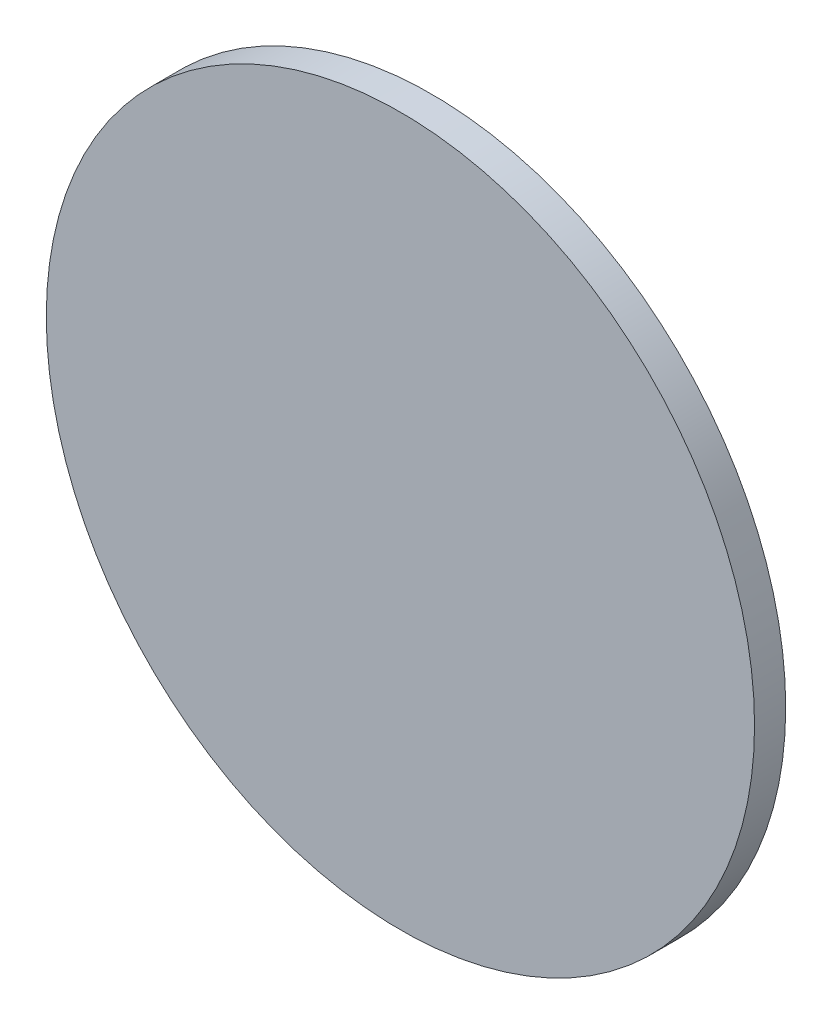
ISO-10303-21;
HEADER;
FILE_DESCRIPTION(('STEP AP214'),'2;1');
FILE_NAME('part.step','',(''),(''),'','','');
FILE_SCHEMA(('AUTOMOTIVE_DESIGN { 1 0 10303 214 1 1 1 1 }'));
ENDSEC;
DATA;
#1=APPLICATION_CONTEXT('core data for automotive mechanical design processes');
#2=APPLICATION_PROTOCOL_DEFINITION('international standard','automotive_design',2000,#1);
#3=PRODUCT_CONTEXT('',#1,'mechanical');
#4=PRODUCT('Part','Part','',(#3));
#5=PRODUCT_RELATED_PRODUCT_CATEGORY('part','',(#4));
#6=PRODUCT_DEFINITION_FORMATION('','',#4);
#7=PRODUCT_DEFINITION_CONTEXT('part definition',#1,'design');
#8=PRODUCT_DEFINITION('design','',#6,#7);
#9=PRODUCT_DEFINITION_SHAPE('','',#8);
#10=(LENGTH_UNIT() NAMED_UNIT(*) SI_UNIT(.MILLI.,.METRE.));
#11=(NAMED_UNIT(*) PLANE_ANGLE_UNIT() SI_UNIT($,.RADIAN.));
#12=(NAMED_UNIT(*) SI_UNIT($,.STERADIAN.) SOLID_ANGLE_UNIT());
#13=UNCERTAINTY_MEASURE_WITH_UNIT(LENGTH_MEASURE(1.E-05),#10,'distance_accuracy_value','');
#14=(GEOMETRIC_REPRESENTATION_CONTEXT(3) GLOBAL_UNCERTAINTY_ASSIGNED_CONTEXT((#13)) GLOBAL_UNIT_ASSIGNED_CONTEXT((#10,
#11,#12)) REPRESENTATION_CONTEXT('',''));
#15=CARTESIAN_POINT('',(0.,0.,0.));
#16=DIRECTION('',(0.,0.,1.));
#17=DIRECTION('',(1.,0.,0.));
#18=AXIS2_PLACEMENT_3D('',#15,#16,#17);
#19=CARTESIAN_POINT('',(0.,0.,0.));
#20=DIRECTION('',(0.,0.,1.));
#21=DIRECTION('',(1.,0.,0.));
#22=AXIS2_PLACEMENT_3D('',#19,#20,#21);
#23=PLANE('',#22);
#24=CARTESIAN_POINT('',(0.,0.,0.));
#25=DIRECTION('',(0.,0.,-1.));
#26=DIRECTION('',(-1.,0.,0.));
#27=AXIS2_PLACEMENT_3D('',#24,#25,#26);
#28=CIRCLE('',#27,12.5);
#29=CARTESIAN_POINT('',(-12.5,0.,0.));
#30=VERTEX_POINT('',#29);
#31=EDGE_CURVE('E17',#30,#30,#28,.F.);
#32=ORIENTED_EDGE('',*,*,#31,.F.);
#33=EDGE_LOOP('',(#32));
#34=FACE_BOUND('',#33,.T.);
#35=ADVANCED_FACE('F14',(#34),#23,.F.);
#36=CARTESIAN_POINT('',(0.,0.,1.1));
#37=DIRECTION('',(0.,0.,-1.));
#38=DIRECTION('',(-1.,0.,0.));
#39=AXIS2_PLACEMENT_3D('',#36,#37,#38);
#40=CYLINDRICAL_SURFACE('',#39,12.5);
#41=ORIENTED_EDGE('',*,*,#31,.T.);
#42=EDGE_LOOP('',(#41));
#43=FACE_BOUND('',#42,.T.);
#44=CARTESIAN_POINT('',(0.,0.,1.1));
#45=DIRECTION('',(0.,0.,-1.));
#46=DIRECTION('',(-1.,0.,0.));
#47=AXIS2_PLACEMENT_3D('',#44,#45,#46);
#48=CIRCLE('',#47,12.5);
#49=CARTESIAN_POINT('',(-12.5,0.,1.1));
#50=VERTEX_POINT('',#49);
#51=EDGE_CURVE('E10',#50,#50,#48,.F.);
#52=ORIENTED_EDGE('',*,*,#51,.F.);
#53=EDGE_LOOP('',(#52));
#54=FACE_BOUND('',#53,.T.);
#55=ADVANCED_FACE('F26',(#43,#54),#40,.T.);
#56=CARTESIAN_POINT('',(0.,0.,1.1));
#57=DIRECTION('',(0.,0.,1.));
#58=DIRECTION('',(1.,0.,0.));
#59=AXIS2_PLACEMENT_3D('',#56,#57,#58);
#60=PLANE('',#59);
#61=ORIENTED_EDGE('',*,*,#51,.T.);
#62=EDGE_LOOP('',(#61));
#63=FACE_BOUND('',#62,.T.);
#64=ADVANCED_FACE('F34',(#63),#60,.T.);
#65=CLOSED_SHELL('',(#35,#55,#64));
#66=MANIFOLD_SOLID_BREP('B1',#65);
#67=ADVANCED_BREP_SHAPE_REPRESENTATION('',(#18,#66),#14);
#68=SHAPE_DEFINITION_REPRESENTATION(#9,#67);
ENDSEC;
END-ISO-10303-21;
